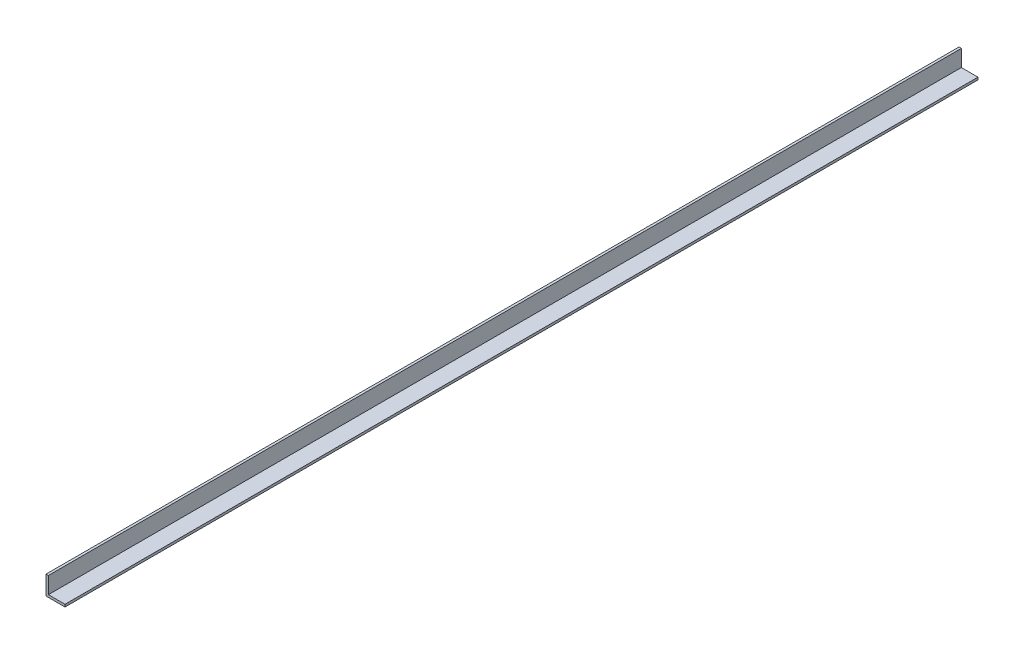
ISO-10303-21;
HEADER;
FILE_DESCRIPTION(('STEP AP214'),'2;1');
FILE_NAME('part.step','',(''),(''),'','','');
FILE_SCHEMA(('AUTOMOTIVE_DESIGN { 1 0 10303 214 1 1 1 1 }'));
ENDSEC;
DATA;
#1=APPLICATION_CONTEXT('core data for automotive mechanical design processes');
#2=APPLICATION_PROTOCOL_DEFINITION('international standard','automotive_design',2000,#1);
#3=PRODUCT_CONTEXT('',#1,'mechanical');
#4=PRODUCT('Part','Part','',(#3));
#5=PRODUCT_RELATED_PRODUCT_CATEGORY('part','',(#4));
#6=PRODUCT_DEFINITION_FORMATION('','',#4);
#7=PRODUCT_DEFINITION_CONTEXT('part definition',#1,'design');
#8=PRODUCT_DEFINITION('design','',#6,#7);
#9=PRODUCT_DEFINITION_SHAPE('','',#8);
#10=(LENGTH_UNIT() NAMED_UNIT(*) SI_UNIT(.MILLI.,.METRE.));
#11=(NAMED_UNIT(*) PLANE_ANGLE_UNIT() SI_UNIT($,.RADIAN.));
#12=(NAMED_UNIT(*) SI_UNIT($,.STERADIAN.) SOLID_ANGLE_UNIT());
#13=UNCERTAINTY_MEASURE_WITH_UNIT(LENGTH_MEASURE(1.E-05),#10,'distance_accuracy_value','');
#14=(GEOMETRIC_REPRESENTATION_CONTEXT(3) GLOBAL_UNCERTAINTY_ASSIGNED_CONTEXT((#13)) GLOBAL_UNIT_ASSIGNED_CONTEXT((#10,
#11,#12)) REPRESENTATION_CONTEXT('',''));
#15=CARTESIAN_POINT('',(0.,0.,0.));
#16=DIRECTION('',(0.,0.,1.));
#17=DIRECTION('',(1.,0.,0.));
#18=AXIS2_PLACEMENT_3D('',#15,#16,#17);
#19=CARTESIAN_POINT('',(0.,0.,609.6));
#20=DIRECTION('',(0.,1.,0.));
#21=DIRECTION('',(0.,0.,1.));
#22=AXIS2_PLACEMENT_3D('',#19,#20,#21);
#23=PLANE('',#22);
#24=DIRECTION('',(1.,0.,0.));
#25=VECTOR('',#24,1.);
#26=CARTESIAN_POINT('',(0.,0.,0.));
#27=LINE('',#26,#25);
#28=CARTESIAN_POINT('',(0.,0.,0.));
#29=VERTEX_POINT('',#28);
#30=CARTESIAN_POINT('',(12.7,0.,0.));
#31=VERTEX_POINT('',#30);
#32=EDGE_CURVE('E119',#29,#31,#27,.T.);
#33=ORIENTED_EDGE('',*,*,#32,.T.);
#34=DIRECTION('',(0.,0.,-1.));
#35=VECTOR('',#34,1.);
#36=CARTESIAN_POINT('',(12.7,0.,609.6));
#37=LINE('',#36,#35);
#38=CARTESIAN_POINT('',(12.7,0.,609.6));
#39=VERTEX_POINT('',#38);
#40=EDGE_CURVE('E11',#39,#31,#37,.T.);
#41=ORIENTED_EDGE('',*,*,#40,.F.);
#42=DIRECTION('',(1.,0.,0.));
#43=VECTOR('',#42,1.);
#44=CARTESIAN_POINT('',(0.,0.,609.6));
#45=LINE('',#44,#43);
#46=CARTESIAN_POINT('',(0.,0.,609.6));
#47=VERTEX_POINT('',#46);
#48=EDGE_CURVE('E133',#47,#39,#45,.T.);
#49=ORIENTED_EDGE('',*,*,#48,.F.);
#50=DIRECTION('',(0.,0.,-1.));
#51=VECTOR('',#50,1.);
#52=CARTESIAN_POINT('',(0.,0.,609.6));
#53=LINE('',#52,#51);
#54=EDGE_CURVE('E51',#47,#29,#53,.T.);
#55=ORIENTED_EDGE('',*,*,#54,.T.);
#56=EDGE_LOOP('',(#33,#41,#49,#55));
#57=FACE_BOUND('',#56,.T.);
#58=ADVANCED_FACE('F35',(#57),#23,.F.);
#59=CARTESIAN_POINT('',(12.7,0.,609.6));
#60=DIRECTION('',(-1.,0.,0.));
#61=DIRECTION('',(0.,0.,1.));
#62=AXIS2_PLACEMENT_3D('',#59,#60,#61);
#63=PLANE('',#62);
#64=DIRECTION('',(0.,1.,0.));
#65=VECTOR('',#64,1.);
#66=CARTESIAN_POINT('',(12.7,0.,0.));
#67=LINE('',#66,#65);
#68=CARTESIAN_POINT('',(12.7,1.6002,0.));
#69=VERTEX_POINT('',#68);
#70=EDGE_CURVE('E121',#31,#69,#67,.T.);
#71=ORIENTED_EDGE('',*,*,#70,.T.);
#72=DIRECTION('',(0.,0.,-1.));
#73=VECTOR('',#72,1.);
#74=CARTESIAN_POINT('',(12.7,1.6002,609.6));
#75=LINE('',#74,#73);
#76=CARTESIAN_POINT('',(12.7,1.6002,609.6));
#77=VERTEX_POINT('',#76);
#78=EDGE_CURVE('E43',#77,#69,#75,.T.);
#79=ORIENTED_EDGE('',*,*,#78,.F.);
#80=DIRECTION('',(0.,1.,0.));
#81=VECTOR('',#80,1.);
#82=CARTESIAN_POINT('',(12.7,0.,609.6));
#83=LINE('',#82,#81);
#84=EDGE_CURVE('E83',#39,#77,#83,.T.);
#85=ORIENTED_EDGE('',*,*,#84,.F.);
#86=ORIENTED_EDGE('',*,*,#40,.T.);
#87=EDGE_LOOP('',(#71,#79,#85,#86));
#88=FACE_BOUND('',#87,.T.);
#89=ADVANCED_FACE('F139',(#88),#63,.F.);
#90=CARTESIAN_POINT('',(0.,1.6002,609.6));
#91=DIRECTION('',(0.,1.,0.));
#92=DIRECTION('',(0.,0.,1.));
#93=AXIS2_PLACEMENT_3D('',#90,#91,#92);
#94=PLANE('',#93);
#95=DIRECTION('',(1.,0.,0.));
#96=VECTOR('',#95,1.);
#97=CARTESIAN_POINT('',(0.,1.6002,0.));
#98=LINE('',#97,#96);
#99=CARTESIAN_POINT('',(1.6002,1.6002,0.));
#100=VERTEX_POINT('',#99);
#101=EDGE_CURVE('E124',#100,#69,#98,.T.);
#102=ORIENTED_EDGE('',*,*,#101,.F.);
#103=DIRECTION('',(0.,0.,-1.));
#104=VECTOR('',#103,1.);
#105=CARTESIAN_POINT('',(1.6002,1.6002,609.6));
#106=LINE('',#105,#104);
#107=CARTESIAN_POINT('',(1.6002,1.6002,609.6));
#108=VERTEX_POINT('',#107);
#109=EDGE_CURVE('E111',#108,#100,#106,.T.);
#110=ORIENTED_EDGE('',*,*,#109,.F.);
#111=DIRECTION('',(1.,0.,0.));
#112=VECTOR('',#111,1.);
#113=CARTESIAN_POINT('',(0.,1.6002,609.6));
#114=LINE('',#113,#112);
#115=EDGE_CURVE('E101',#108,#77,#114,.T.);
#116=ORIENTED_EDGE('',*,*,#115,.T.);
#117=ORIENTED_EDGE('',*,*,#78,.T.);
#118=EDGE_LOOP('',(#102,#110,#116,#117));
#119=FACE_BOUND('',#118,.T.);
#120=ADVANCED_FACE('F138',(#119),#94,.T.);
#121=CARTESIAN_POINT('',(1.6002,0.,609.6));
#122=DIRECTION('',(-1.,0.,0.));
#123=DIRECTION('',(0.,0.,1.));
#124=AXIS2_PLACEMENT_3D('',#121,#122,#123);
#125=PLANE('',#124);
#126=DIRECTION('',(0.,1.,0.));
#127=VECTOR('',#126,1.);
#128=CARTESIAN_POINT('',(1.6002,0.,0.));
#129=LINE('',#128,#127);
#130=CARTESIAN_POINT('',(1.6002,12.7,0.));
#131=VERTEX_POINT('',#130);
#132=EDGE_CURVE('E108',#100,#131,#129,.T.);
#133=ORIENTED_EDGE('',*,*,#132,.T.);
#134=DIRECTION('',(0.,0.,-1.));
#135=VECTOR('',#134,1.);
#136=CARTESIAN_POINT('',(1.6002,12.7,609.6));
#137=LINE('',#136,#135);
#138=CARTESIAN_POINT('',(1.6002,12.7,609.6));
#139=VERTEX_POINT('',#138);
#140=EDGE_CURVE('E105',#139,#131,#137,.T.);
#141=ORIENTED_EDGE('',*,*,#140,.F.);
#142=DIRECTION('',(0.,1.,0.));
#143=VECTOR('',#142,1.);
#144=CARTESIAN_POINT('',(1.6002,0.,609.6));
#145=LINE('',#144,#143);
#146=EDGE_CURVE('E94',#108,#139,#145,.T.);
#147=ORIENTED_EDGE('',*,*,#146,.F.);
#148=ORIENTED_EDGE('',*,*,#109,.T.);
#149=EDGE_LOOP('',(#133,#141,#147,#148));
#150=FACE_BOUND('',#149,.T.);
#151=ADVANCED_FACE('F106',(#150),#125,.F.);
#152=CARTESIAN_POINT('',(0.,12.7,609.6));
#153=DIRECTION('',(0.,1.,0.));
#154=DIRECTION('',(0.,0.,1.));
#155=AXIS2_PLACEMENT_3D('',#152,#153,#154);
#156=PLANE('',#155);
#157=DIRECTION('',(1.,0.,0.));
#158=VECTOR('',#157,1.);
#159=CARTESIAN_POINT('',(0.,12.7,0.));
#160=LINE('',#159,#158);
#161=CARTESIAN_POINT('',(0.,12.7,0.));
#162=VERTEX_POINT('',#161);
#163=EDGE_CURVE('E128',#162,#131,#160,.T.);
#164=ORIENTED_EDGE('',*,*,#163,.F.);
#165=DIRECTION('',(0.,0.,-1.));
#166=VECTOR('',#165,1.);
#167=CARTESIAN_POINT('',(0.,12.7,609.6));
#168=LINE('',#167,#166);
#169=CARTESIAN_POINT('',(0.,12.7,609.6));
#170=VERTEX_POINT('',#169);
#171=EDGE_CURVE('E71',#170,#162,#168,.T.);
#172=ORIENTED_EDGE('',*,*,#171,.F.);
#173=DIRECTION('',(1.,0.,0.));
#174=VECTOR('',#173,1.);
#175=CARTESIAN_POINT('',(0.,12.7,609.6));
#176=LINE('',#175,#174);
#177=EDGE_CURVE('E99',#170,#139,#176,.T.);
#178=ORIENTED_EDGE('',*,*,#177,.T.);
#179=ORIENTED_EDGE('',*,*,#140,.T.);
#180=EDGE_LOOP('',(#164,#172,#178,#179));
#181=FACE_BOUND('',#180,.T.);
#182=ADVANCED_FACE('F113',(#181),#156,.T.);
#183=CARTESIAN_POINT('',(0.,0.,609.6));
#184=DIRECTION('',(-1.,0.,0.));
#185=DIRECTION('',(0.,0.,1.));
#186=AXIS2_PLACEMENT_3D('',#183,#184,#185);
#187=PLANE('',#186);
#188=DIRECTION('',(0.,1.,0.));
#189=VECTOR('',#188,1.);
#190=CARTESIAN_POINT('',(0.,0.,0.));
#191=LINE('',#190,#189);
#192=EDGE_CURVE('E130',#29,#162,#191,.T.);
#193=ORIENTED_EDGE('',*,*,#192,.F.);
#194=ORIENTED_EDGE('',*,*,#54,.F.);
#195=DIRECTION('',(0.,1.,0.));
#196=VECTOR('',#195,1.);
#197=CARTESIAN_POINT('',(0.,0.,609.6));
#198=LINE('',#197,#196);
#199=EDGE_CURVE('E114',#47,#170,#198,.T.);
#200=ORIENTED_EDGE('',*,*,#199,.T.);
#201=ORIENTED_EDGE('',*,*,#171,.T.);
#202=EDGE_LOOP('',(#193,#194,#200,#201));
#203=FACE_BOUND('',#202,.T.);
#204=ADVANCED_FACE('F143',(#203),#187,.T.);
#205=CARTESIAN_POINT('',(0.,0.,609.6));
#206=DIRECTION('',(0.,0.,1.));
#207=DIRECTION('',(1.,0.,0.));
#208=AXIS2_PLACEMENT_3D('',#205,#206,#207);
#209=PLANE('',#208);
#210=ORIENTED_EDGE('',*,*,#48,.T.);
#211=ORIENTED_EDGE('',*,*,#84,.T.);
#212=ORIENTED_EDGE('',*,*,#115,.F.);
#213=ORIENTED_EDGE('',*,*,#146,.T.);
#214=ORIENTED_EDGE('',*,*,#177,.F.);
#215=ORIENTED_EDGE('',*,*,#199,.F.);
#216=EDGE_LOOP('',(#210,#211,#212,#213,#214,#215));
#217=FACE_BOUND('',#216,.T.);
#218=ADVANCED_FACE('F96',(#217),#209,.T.);
#219=CARTESIAN_POINT('',(0.,0.,0.));
#220=DIRECTION('',(0.,0.,1.));
#221=DIRECTION('',(1.,0.,0.));
#222=AXIS2_PLACEMENT_3D('',#219,#220,#221);
#223=PLANE('',#222);
#224=ORIENTED_EDGE('',*,*,#32,.F.);
#225=ORIENTED_EDGE('',*,*,#192,.T.);
#226=ORIENTED_EDGE('',*,*,#163,.T.);
#227=ORIENTED_EDGE('',*,*,#132,.F.);
#228=ORIENTED_EDGE('',*,*,#101,.T.);
#229=ORIENTED_EDGE('',*,*,#70,.F.);
#230=EDGE_LOOP('',(#224,#225,#226,#227,#228,#229));
#231=FACE_BOUND('',#230,.T.);
#232=ADVANCED_FACE('F142',(#231),#223,.F.);
#233=CLOSED_SHELL('',(#58,#89,#120,#151,#182,#204,#218,#232));
#234=MANIFOLD_SOLID_BREP('B2',#233);
#235=ADVANCED_BREP_SHAPE_REPRESENTATION('',(#18,#234),#14);
#236=SHAPE_DEFINITION_REPRESENTATION(#9,#235);
ENDSEC;
END-ISO-10303-21;
